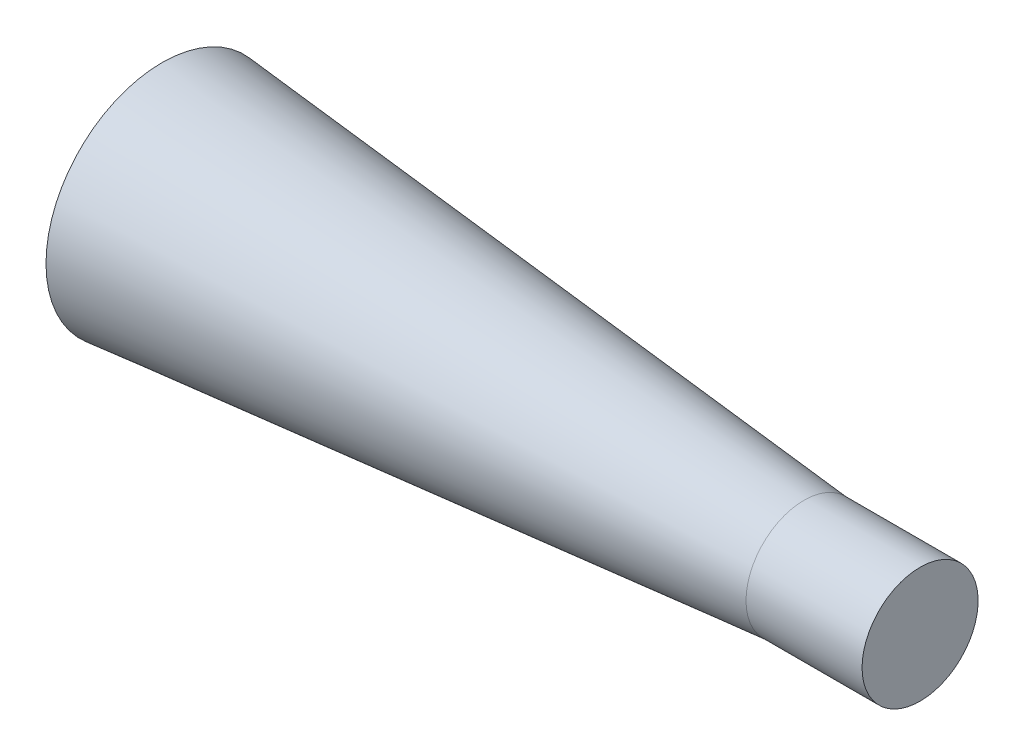
ISO-10303-21;
HEADER;
FILE_DESCRIPTION(('STEP AP214'),'2;1');
FILE_NAME('part.step','',(''),(''),'','','');
FILE_SCHEMA(('AUTOMOTIVE_DESIGN { 1 0 10303 214 1 1 1 1 }'));
ENDSEC;
DATA;
#1=APPLICATION_CONTEXT('core data for automotive mechanical design processes');
#2=APPLICATION_PROTOCOL_DEFINITION('international standard','automotive_design',2000,#1);
#3=PRODUCT_CONTEXT('',#1,'mechanical');
#4=PRODUCT('Part','Part','',(#3));
#5=PRODUCT_RELATED_PRODUCT_CATEGORY('part','',(#4));
#6=PRODUCT_DEFINITION_FORMATION('','',#4);
#7=PRODUCT_DEFINITION_CONTEXT('part definition',#1,'design');
#8=PRODUCT_DEFINITION('design','',#6,#7);
#9=PRODUCT_DEFINITION_SHAPE('','',#8);
#10=(LENGTH_UNIT() NAMED_UNIT(*) SI_UNIT(.MILLI.,.METRE.));
#11=(NAMED_UNIT(*) PLANE_ANGLE_UNIT() SI_UNIT($,.RADIAN.));
#12=(NAMED_UNIT(*) SI_UNIT($,.STERADIAN.) SOLID_ANGLE_UNIT());
#13=UNCERTAINTY_MEASURE_WITH_UNIT(LENGTH_MEASURE(1.E-05),#10,'distance_accuracy_value','');
#14=(GEOMETRIC_REPRESENTATION_CONTEXT(3) GLOBAL_UNCERTAINTY_ASSIGNED_CONTEXT((#13)) GLOBAL_UNIT_ASSIGNED_CONTEXT((#10,
#11,#12)) REPRESENTATION_CONTEXT('',''));
#15=CARTESIAN_POINT('',(0.,0.,0.));
#16=DIRECTION('',(0.,0.,1.));
#17=DIRECTION('',(1.,0.,0.));
#18=AXIS2_PLACEMENT_3D('',#15,#16,#17);
#19=CARTESIAN_POINT('',(29.,0.,0.));
#20=DIRECTION('',(-1.,0.,0.));
#21=DIRECTION('',(0.,0.,1.));
#22=AXIS2_PLACEMENT_3D('',#19,#20,#21);
#23=CONICAL_SURFACE('',#22,2.5,0.0901374834862684);
#24=CARTESIAN_POINT('',(1.33974596215561,0.,0.));
#25=DIRECTION('',(-1.,0.,0.));
#26=DIRECTION('',(0.,0.,1.));
#27=AXIS2_PLACEMENT_3D('',#24,#25,#26);
#28=CIRCLE('',#27,5.);
#29=CARTESIAN_POINT('',(1.33974596215561,0.,5.));
#30=VERTEX_POINT('',#29);
#31=EDGE_CURVE('E10',#30,#30,#28,.T.);
#32=ORIENTED_EDGE('',*,*,#31,.F.);
#33=EDGE_LOOP('',(#32));
#34=FACE_BOUND('',#33,.T.);
#35=CARTESIAN_POINT('',(29.,0.,0.));
#36=DIRECTION('',(-1.,0.,0.));
#37=DIRECTION('',(0.,0.,1.));
#38=AXIS2_PLACEMENT_3D('',#35,#36,#37);
#39=CIRCLE('',#38,2.5);
#40=CARTESIAN_POINT('',(29.,0.,2.5));
#41=VERTEX_POINT('',#40);
#42=EDGE_CURVE('E47',#41,#41,#39,.T.);
#43=ORIENTED_EDGE('',*,*,#42,.T.);
#44=EDGE_LOOP('',(#43));
#45=FACE_BOUND('',#44,.T.);
#46=ADVANCED_FACE('F37',(#34,#45),#23,.T.);
#47=CARTESIAN_POINT('',(10.,0.,0.));
#48=DIRECTION('',(-1.,0.,0.));
#49=DIRECTION('',(0.,1.,0.));
#50=AXIS2_PLACEMENT_3D('',#47,#48,#49);
#51=SPHERICAL_SURFACE('',#50,10.);
#52=ORIENTED_EDGE('',*,*,#31,.T.);
#53=EDGE_LOOP('',(#52));
#54=FACE_BOUND('',#53,.T.);
#55=ADVANCED_FACE('F62',(#54),#51,.T.);
#56=CARTESIAN_POINT('',(34.,0.,0.));
#57=DIRECTION('',(-1.,0.,0.));
#58=DIRECTION('',(0.,0.,1.));
#59=AXIS2_PLACEMENT_3D('',#56,#57,#58);
#60=PLANE('',#59);
#61=CARTESIAN_POINT('',(34.,0.,0.));
#62=DIRECTION('',(-1.,0.,0.));
#63=DIRECTION('',(0.,0.,1.));
#64=AXIS2_PLACEMENT_3D('',#61,#62,#63);
#65=CIRCLE('',#64,2.5);
#66=CARTESIAN_POINT('',(34.,0.,2.5));
#67=VERTEX_POINT('',#66);
#68=EDGE_CURVE('E43',#67,#67,#65,.T.);
#69=ORIENTED_EDGE('',*,*,#68,.F.);
#70=EDGE_LOOP('',(#69));
#71=FACE_BOUND('',#70,.T.);
#72=ADVANCED_FACE('F57',(#71),#60,.F.);
#73=CARTESIAN_POINT('',(0.,0.,0.));
#74=DIRECTION('',(-1.,0.,0.));
#75=DIRECTION('',(0.,0.,1.));
#76=AXIS2_PLACEMENT_3D('',#73,#74,#75);
#77=CYLINDRICAL_SURFACE('',#76,2.5);
#78=ORIENTED_EDGE('',*,*,#42,.F.);
#79=EDGE_LOOP('',(#78));
#80=FACE_BOUND('',#79,.T.);
#81=ORIENTED_EDGE('',*,*,#68,.T.);
#82=EDGE_LOOP('',(#81));
#83=FACE_BOUND('',#82,.T.);
#84=ADVANCED_FACE('F55',(#80,#83),#77,.T.);
#85=CLOSED_SHELL('',(#46,#55,#72,#84));
#86=MANIFOLD_SOLID_BREP('B2',#85);
#87=ADVANCED_BREP_SHAPE_REPRESENTATION('',(#18,#86),#14);
#88=SHAPE_DEFINITION_REPRESENTATION(#9,#87);
ENDSEC;
END-ISO-10303-21;
